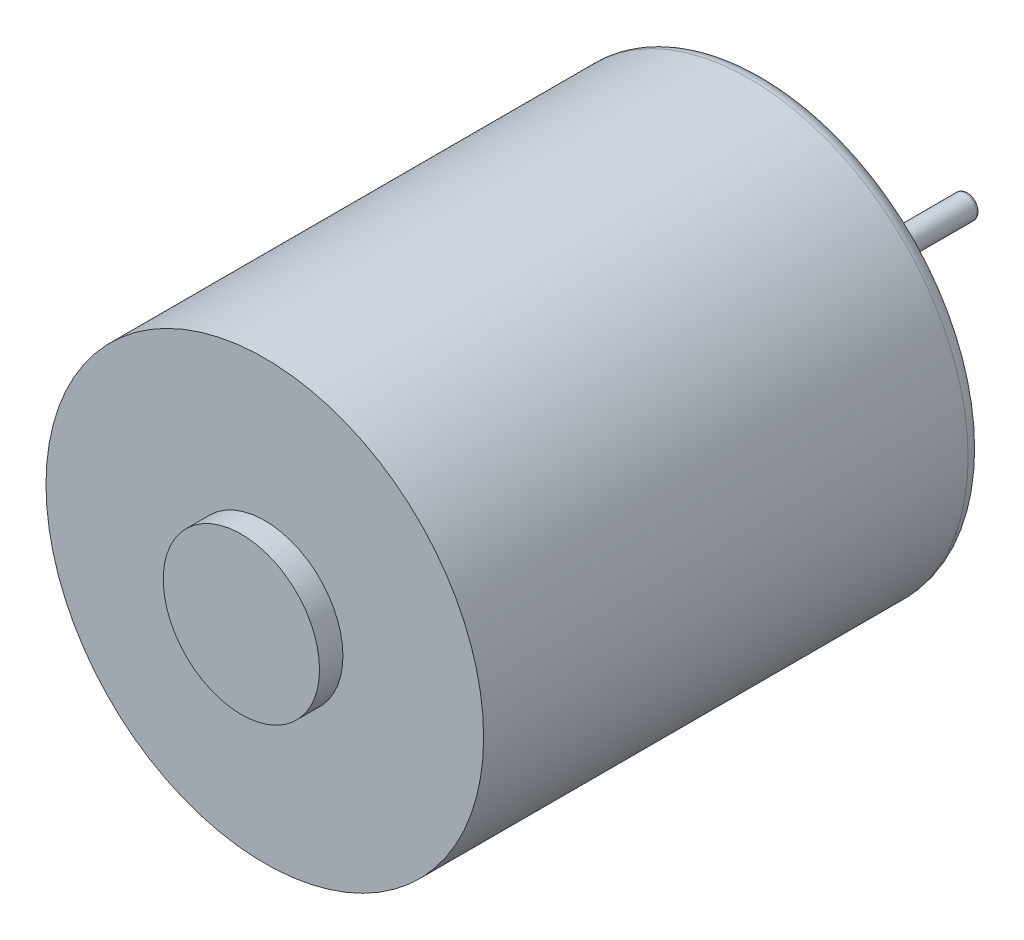
ISO-10303-21;
HEADER;
FILE_DESCRIPTION(('STEP AP214'),'2;1');
FILE_NAME('part.step','',(''),(''),'','','');
FILE_SCHEMA(('AUTOMOTIVE_DESIGN { 1 0 10303 214 1 1 1 1 }'));
ENDSEC;
DATA;
#1=APPLICATION_CONTEXT('core data for automotive mechanical design processes');
#2=APPLICATION_PROTOCOL_DEFINITION('international standard','automotive_design',2000,#1);
#3=PRODUCT_CONTEXT('',#1,'mechanical');
#4=PRODUCT('Part','Part','',(#3));
#5=PRODUCT_RELATED_PRODUCT_CATEGORY('part','',(#4));
#6=PRODUCT_DEFINITION_FORMATION('','',#4);
#7=PRODUCT_DEFINITION_CONTEXT('part definition',#1,'design');
#8=PRODUCT_DEFINITION('design','',#6,#7);
#9=PRODUCT_DEFINITION_SHAPE('','',#8);
#10=(LENGTH_UNIT() NAMED_UNIT(*) SI_UNIT(.MILLI.,.METRE.));
#11=(NAMED_UNIT(*) PLANE_ANGLE_UNIT() SI_UNIT($,.RADIAN.));
#12=(NAMED_UNIT(*) SI_UNIT($,.STERADIAN.) SOLID_ANGLE_UNIT());
#13=UNCERTAINTY_MEASURE_WITH_UNIT(LENGTH_MEASURE(1.E-05),#10,'distance_accuracy_value','');
#14=(GEOMETRIC_REPRESENTATION_CONTEXT(3) GLOBAL_UNCERTAINTY_ASSIGNED_CONTEXT((#13)) GLOBAL_UNIT_ASSIGNED_CONTEXT((#10,
#11,#12)) REPRESENTATION_CONTEXT('',''));
#15=CARTESIAN_POINT('',(0.,0.,0.));
#16=DIRECTION('',(0.,0.,1.));
#17=DIRECTION('',(1.,0.,0.));
#18=AXIS2_PLACEMENT_3D('',#15,#16,#17);
#19=CARTESIAN_POINT('',(0.,0.,32.));
#20=DIRECTION('',(0.,0.,-1.));
#21=DIRECTION('',(-1.,0.,0.));
#22=AXIS2_PLACEMENT_3D('',#19,#20,#21);
#23=CYLINDRICAL_SURFACE('',#22,14.);
#24=CARTESIAN_POINT('',(0.,0.,1.));
#25=DIRECTION('',(0.,0.,1.));
#26=DIRECTION('',(1.,0.,0.));
#27=AXIS2_PLACEMENT_3D('',#24,#25,#26);
#28=CIRCLE('',#27,14.);
#29=CARTESIAN_POINT('',(14.,0.,1.));
#30=VERTEX_POINT('',#29);
#31=EDGE_CURVE('E46',#30,#30,#28,.T.);
#32=ORIENTED_EDGE('',*,*,#31,.T.);
#33=EDGE_LOOP('',(#32));
#34=FACE_BOUND('',#33,.T.);
#35=CARTESIAN_POINT('',(0.,0.,32.));
#36=DIRECTION('',(0.,0.,1.));
#37=DIRECTION('',(1.,0.,0.));
#38=AXIS2_PLACEMENT_3D('',#35,#36,#37);
#39=CIRCLE('',#38,14.);
#40=CARTESIAN_POINT('',(14.,0.,32.));
#41=VERTEX_POINT('',#40);
#42=EDGE_CURVE('E52',#41,#41,#39,.T.);
#43=ORIENTED_EDGE('',*,*,#42,.F.);
#44=EDGE_LOOP('',(#43));
#45=FACE_BOUND('',#44,.T.);
#46=ADVANCED_FACE('F31',(#34,#45),#23,.T.);
#47=CARTESIAN_POINT('',(0.,0.,32.));
#48=DIRECTION('',(0.,0.,1.));
#49=DIRECTION('',(1.,0.,0.));
#50=AXIS2_PLACEMENT_3D('',#47,#48,#49);
#51=PLANE('',#50);
#52=CARTESIAN_POINT('',(0.,0.,32.));
#53=DIRECTION('',(0.,0.,1.));
#54=DIRECTION('',(1.,0.,0.));
#55=AXIS2_PLACEMENT_3D('',#52,#53,#54);
#56=CIRCLE('',#55,5.);
#57=CARTESIAN_POINT('',(5.,0.,32.));
#58=VERTEX_POINT('',#57);
#59=EDGE_CURVE('E55',#58,#58,#56,.T.);
#60=ORIENTED_EDGE('',*,*,#59,.F.);
#61=EDGE_LOOP('',(#60));
#62=FACE_BOUND('',#61,.T.);
#63=ORIENTED_EDGE('',*,*,#42,.T.);
#64=EDGE_LOOP('',(#63));
#65=FACE_BOUND('',#64,.T.);
#66=ADVANCED_FACE('F95',(#62,#65),#51,.T.);
#67=CARTESIAN_POINT('',(0.,0.,0.));
#68=DIRECTION('',(0.,0.,1.));
#69=DIRECTION('',(1.,0.,0.));
#70=AXIS2_PLACEMENT_3D('',#67,#68,#69);
#71=PLANE('',#70);
#72=CARTESIAN_POINT('',(0.,0.,0.));
#73=DIRECTION('',(0.,0.,1.));
#74=DIRECTION('',(1.,0.,0.));
#75=AXIS2_PLACEMENT_3D('',#72,#73,#74);
#76=CIRCLE('',#75,13.);
#77=CARTESIAN_POINT('',(13.,0.,0.));
#78=VERTEX_POINT('',#77);
#79=EDGE_CURVE('E42',#78,#78,#76,.F.);
#80=ORIENTED_EDGE('',*,*,#79,.T.);
#81=EDGE_LOOP('',(#80));
#82=FACE_BOUND('',#81,.T.);
#83=CARTESIAN_POINT('',(-8.,0.,0.));
#84=DIRECTION('',(0.,0.,-1.));
#85=DIRECTION('',(-1.,0.,0.));
#86=AXIS2_PLACEMENT_3D('',#83,#84,#85);
#87=CIRCLE('',#86,1.);
#88=CARTESIAN_POINT('',(-9.,0.,0.));
#89=VERTEX_POINT('',#88);
#90=EDGE_CURVE('E76',#89,#89,#87,.T.);
#91=ORIENTED_EDGE('',*,*,#90,.F.);
#92=EDGE_LOOP('',(#91));
#93=FACE_BOUND('',#92,.T.);
#94=CARTESIAN_POINT('',(8.,0.,0.));
#95=DIRECTION('',(0.,0.,-1.));
#96=DIRECTION('',(-1.,0.,0.));
#97=AXIS2_PLACEMENT_3D('',#94,#95,#96);
#98=CIRCLE('',#97,1.);
#99=CARTESIAN_POINT('',(7.,0.,0.));
#100=VERTEX_POINT('',#99);
#101=EDGE_CURVE('E70',#100,#100,#98,.T.);
#102=ORIENTED_EDGE('',*,*,#101,.F.);
#103=EDGE_LOOP('',(#102));
#104=FACE_BOUND('',#103,.T.);
#105=CARTESIAN_POINT('',(0.,0.,0.));
#106=DIRECTION('',(0.,0.,-1.));
#107=DIRECTION('',(-1.,0.,0.));
#108=AXIS2_PLACEMENT_3D('',#105,#106,#107);
#109=CIRCLE('',#108,5.);
#110=CARTESIAN_POINT('',(-5.,0.,0.));
#111=VERTEX_POINT('',#110);
#112=EDGE_CURVE('E59',#111,#111,#109,.T.);
#113=ORIENTED_EDGE('',*,*,#112,.F.);
#114=EDGE_LOOP('',(#113));
#115=FACE_BOUND('',#114,.T.);
#116=ADVANCED_FACE('F91',(#82,#93,#104,#115),#71,.F.);
#117=CARTESIAN_POINT('',(0.,0.,33.5));
#118=DIRECTION('',(0.,0.,-1.));
#119=DIRECTION('',(-1.,0.,0.));
#120=AXIS2_PLACEMENT_3D('',#117,#118,#119);
#121=CYLINDRICAL_SURFACE('',#120,5.);
#122=CARTESIAN_POINT('',(0.,0.,33.5));
#123=DIRECTION('',(0.,0.,1.));
#124=DIRECTION('',(1.,0.,0.));
#125=AXIS2_PLACEMENT_3D('',#122,#123,#124);
#126=CIRCLE('',#125,5.);
#127=CARTESIAN_POINT('',(5.,0.,33.5));
#128=VERTEX_POINT('',#127);
#129=EDGE_CURVE('E56',#128,#128,#126,.T.);
#130=ORIENTED_EDGE('',*,*,#129,.F.);
#131=EDGE_LOOP('',(#130));
#132=FACE_BOUND('',#131,.T.);
#133=ORIENTED_EDGE('',*,*,#59,.T.);
#134=EDGE_LOOP('',(#133));
#135=FACE_BOUND('',#134,.T.);
#136=ADVANCED_FACE('F94',(#132,#135),#121,.T.);
#137=CARTESIAN_POINT('',(0.,0.,33.5));
#138=DIRECTION('',(0.,0.,1.));
#139=DIRECTION('',(1.,0.,0.));
#140=AXIS2_PLACEMENT_3D('',#137,#138,#139);
#141=PLANE('',#140);
#142=ORIENTED_EDGE('',*,*,#129,.T.);
#143=EDGE_LOOP('',(#142));
#144=FACE_BOUND('',#143,.T.);
#145=ADVANCED_FACE('F105',(#144),#141,.T.);
#146=CARTESIAN_POINT('',(0.,0.,-3.5));
#147=DIRECTION('',(0.,0.,1.));
#148=DIRECTION('',(1.,0.,0.));
#149=AXIS2_PLACEMENT_3D('',#146,#147,#148);
#150=CYLINDRICAL_SURFACE('',#149,5.);
#151=CARTESIAN_POINT('',(0.,0.,-3.5));
#152=DIRECTION('',(0.,0.,-1.));
#153=DIRECTION('',(-1.,0.,0.));
#154=AXIS2_PLACEMENT_3D('',#151,#152,#153);
#155=CIRCLE('',#154,5.);
#156=CARTESIAN_POINT('',(-5.,0.,-3.5));
#157=VERTEX_POINT('',#156);
#158=EDGE_CURVE('E62',#157,#157,#155,.T.);
#159=ORIENTED_EDGE('',*,*,#158,.F.);
#160=EDGE_LOOP('',(#159));
#161=FACE_BOUND('',#160,.T.);
#162=ORIENTED_EDGE('',*,*,#112,.T.);
#163=EDGE_LOOP('',(#162));
#164=FACE_BOUND('',#163,.T.);
#165=ADVANCED_FACE('F102',(#161,#164),#150,.T.);
#166=CARTESIAN_POINT('',(0.,0.,-3.5));
#167=DIRECTION('',(0.,0.,-1.));
#168=DIRECTION('',(-1.,0.,0.));
#169=AXIS2_PLACEMENT_3D('',#166,#167,#168);
#170=PLANE('',#169);
#171=CARTESIAN_POINT('',(0.,0.,-3.5));
#172=DIRECTION('',(0.,0.,-1.));
#173=DIRECTION('',(-1.,0.,0.));
#174=AXIS2_PLACEMENT_3D('',#171,#172,#173);
#175=CIRCLE('',#174,0.75);
#176=CARTESIAN_POINT('',(-0.75,0.,-3.5));
#177=VERTEX_POINT('',#176);
#178=EDGE_CURVE('E51',#177,#177,#175,.T.);
#179=ORIENTED_EDGE('',*,*,#178,.F.);
#180=EDGE_LOOP('',(#179));
#181=FACE_BOUND('',#180,.T.);
#182=ORIENTED_EDGE('',*,*,#158,.T.);
#183=EDGE_LOOP('',(#182));
#184=FACE_BOUND('',#183,.T.);
#185=ADVANCED_FACE('F104',(#181,#184),#170,.T.);
#186=CARTESIAN_POINT('',(0.,0.,-13.));
#187=DIRECTION('',(0.,0.,1.));
#188=DIRECTION('',(1.,0.,0.));
#189=AXIS2_PLACEMENT_3D('',#186,#187,#188);
#190=CYLINDRICAL_SURFACE('',#189,0.75);
#191=CARTESIAN_POINT('',(0.,0.,-12.8));
#192=DIRECTION('',(0.,0.,-1.));
#193=DIRECTION('',(-1.,0.,0.));
#194=AXIS2_PLACEMENT_3D('',#191,#192,#193);
#195=CIRCLE('',#194,0.75);
#196=CARTESIAN_POINT('',(-0.75,0.,-12.8));
#197=VERTEX_POINT('',#196);
#198=EDGE_CURVE('E10',#197,#197,#195,.F.);
#199=ORIENTED_EDGE('',*,*,#198,.T.);
#200=EDGE_LOOP('',(#199));
#201=FACE_BOUND('',#200,.T.);
#202=ORIENTED_EDGE('',*,*,#178,.T.);
#203=EDGE_LOOP('',(#202));
#204=FACE_BOUND('',#203,.T.);
#205=ADVANCED_FACE('F112',(#201,#204),#190,.T.);
#206=CARTESIAN_POINT('',(0.,0.,-13.));
#207=DIRECTION('',(0.,0.,-1.));
#208=DIRECTION('',(-1.,0.,0.));
#209=AXIS2_PLACEMENT_3D('',#206,#207,#208);
#210=PLANE('',#209);
#211=CARTESIAN_POINT('',(0.,0.,-13.));
#212=DIRECTION('',(0.,0.,-1.));
#213=DIRECTION('',(-1.,0.,0.));
#214=AXIS2_PLACEMENT_3D('',#211,#212,#213);
#215=CIRCLE('',#214,0.55);
#216=CARTESIAN_POINT('',(-0.55,0.,-13.));
#217=VERTEX_POINT('',#216);
#218=EDGE_CURVE('E38',#217,#217,#215,.T.);
#219=ORIENTED_EDGE('',*,*,#218,.T.);
#220=EDGE_LOOP('',(#219));
#221=FACE_BOUND('',#220,.T.);
#222=ADVANCED_FACE('F148',(#221),#210,.T.);
#223=CARTESIAN_POINT('',(8.,0.,10.));
#224=DIRECTION('',(0.,0.,-1.));
#225=DIRECTION('',(-1.,0.,0.));
#226=AXIS2_PLACEMENT_3D('',#223,#224,#225);
#227=CYLINDRICAL_SURFACE('',#226,1.);
#228=CARTESIAN_POINT('',(8.,0.,10.));
#229=DIRECTION('',(0.,0.,-1.));
#230=DIRECTION('',(-1.,0.,0.));
#231=AXIS2_PLACEMENT_3D('',#228,#229,#230);
#232=CIRCLE('',#231,1.);
#233=CARTESIAN_POINT('',(7.,0.,10.));
#234=VERTEX_POINT('',#233);
#235=EDGE_CURVE('E73',#234,#234,#232,.T.);
#236=ORIENTED_EDGE('',*,*,#235,.F.);
#237=EDGE_LOOP('',(#236));
#238=FACE_BOUND('',#237,.T.);
#239=ORIENTED_EDGE('',*,*,#101,.T.);
#240=EDGE_LOOP('',(#239));
#241=FACE_BOUND('',#240,.T.);
#242=ADVANCED_FACE('F144',(#238,#241),#227,.F.);
#243=CARTESIAN_POINT('',(8.,0.,10.));
#244=DIRECTION('',(0.,0.,-1.));
#245=DIRECTION('',(-1.,0.,0.));
#246=AXIS2_PLACEMENT_3D('',#243,#244,#245);
#247=PLANE('',#246);
#248=ORIENTED_EDGE('',*,*,#235,.T.);
#249=EDGE_LOOP('',(#248));
#250=FACE_BOUND('',#249,.T.);
#251=ADVANCED_FACE('F87',(#250),#247,.T.);
#252=CARTESIAN_POINT('',(-8.,0.,10.));
#253=DIRECTION('',(0.,0.,-1.));
#254=DIRECTION('',(-1.,0.,0.));
#255=AXIS2_PLACEMENT_3D('',#252,#253,#254);
#256=CYLINDRICAL_SURFACE('',#255,1.);
#257=CARTESIAN_POINT('',(-8.,0.,10.));
#258=DIRECTION('',(0.,0.,-1.));
#259=DIRECTION('',(-1.,0.,0.));
#260=AXIS2_PLACEMENT_3D('',#257,#258,#259);
#261=CIRCLE('',#260,1.);
#262=CARTESIAN_POINT('',(-9.,0.,10.));
#263=VERTEX_POINT('',#262);
#264=EDGE_CURVE('E67',#263,#263,#261,.T.);
#265=ORIENTED_EDGE('',*,*,#264,.F.);
#266=EDGE_LOOP('',(#265));
#267=FACE_BOUND('',#266,.T.);
#268=ORIENTED_EDGE('',*,*,#90,.T.);
#269=EDGE_LOOP('',(#268));
#270=FACE_BOUND('',#269,.T.);
#271=ADVANCED_FACE('F84',(#267,#270),#256,.F.);
#272=CARTESIAN_POINT('',(-8.,0.,10.));
#273=DIRECTION('',(0.,0.,-1.));
#274=DIRECTION('',(-1.,0.,0.));
#275=AXIS2_PLACEMENT_3D('',#272,#273,#274);
#276=PLANE('',#275);
#277=ORIENTED_EDGE('',*,*,#264,.T.);
#278=EDGE_LOOP('',(#277));
#279=FACE_BOUND('',#278,.T.);
#280=ADVANCED_FACE('F82',(#279),#276,.T.);
#281=CARTESIAN_POINT('',(0.,0.,1.));
#282=DIRECTION('',(0.,0.,1.));
#283=DIRECTION('',(1.,0.,0.));
#284=AXIS2_PLACEMENT_3D('',#281,#282,#283);
#285=TOROIDAL_SURFACE('',#284,13.,1.);
#286=ORIENTED_EDGE('',*,*,#79,.F.);
#287=EDGE_LOOP('',(#286));
#288=FACE_BOUND('',#287,.T.);
#289=ORIENTED_EDGE('',*,*,#31,.F.);
#290=EDGE_LOOP('',(#289));
#291=FACE_BOUND('',#290,.T.);
#292=ADVANCED_FACE('F127',(#288,#291),#285,.T.);
#293=CARTESIAN_POINT('',(0.,0.,-12.8));
#294=DIRECTION('',(0.,0.,-1.));
#295=DIRECTION('',(-1.,0.,0.));
#296=AXIS2_PLACEMENT_3D('',#293,#294,#295);
#297=TOROIDAL_SURFACE('',#296,0.55,0.2);
#298=ORIENTED_EDGE('',*,*,#198,.F.);
#299=EDGE_LOOP('',(#298));
#300=FACE_BOUND('',#299,.T.);
#301=ORIENTED_EDGE('',*,*,#218,.F.);
#302=EDGE_LOOP('',(#301));
#303=FACE_BOUND('',#302,.T.);
#304=ADVANCED_FACE('F33',(#300,#303),#297,.T.);
#305=CLOSED_SHELL('',(#46,#66,#116,#136,#145,#165,#185,#205,#222,#242,#251,#271,#280,#292,#304));
#306=MANIFOLD_SOLID_BREP('B2',#305);
#307=ADVANCED_BREP_SHAPE_REPRESENTATION('',(#18,#306),#14);
#308=SHAPE_DEFINITION_REPRESENTATION(#9,#307);
ENDSEC;
END-ISO-10303-21;
